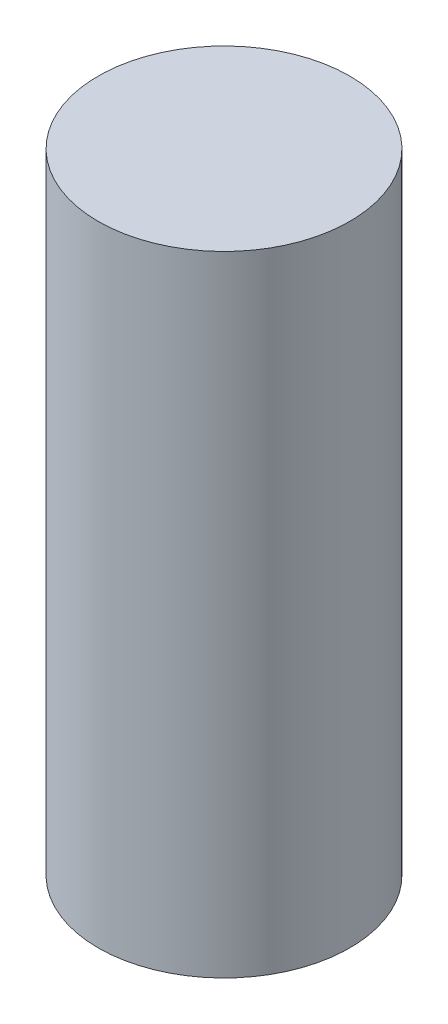
ISO-10303-21;
HEADER;
FILE_DESCRIPTION(('STEP AP214'),'2;1');
FILE_NAME('part.step','',(''),(''),'','','');
FILE_SCHEMA(('AUTOMOTIVE_DESIGN { 1 0 10303 214 1 1 1 1 }'));
ENDSEC;
DATA;
#1=APPLICATION_CONTEXT('core data for automotive mechanical design processes');
#2=APPLICATION_PROTOCOL_DEFINITION('international standard','automotive_design',2000,#1);
#3=PRODUCT_CONTEXT('',#1,'mechanical');
#4=PRODUCT('Part','Part','',(#3));
#5=PRODUCT_RELATED_PRODUCT_CATEGORY('part','',(#4));
#6=PRODUCT_DEFINITION_FORMATION('','',#4);
#7=PRODUCT_DEFINITION_CONTEXT('part definition',#1,'design');
#8=PRODUCT_DEFINITION('design','',#6,#7);
#9=PRODUCT_DEFINITION_SHAPE('','',#8);
#10=(LENGTH_UNIT() NAMED_UNIT(*) SI_UNIT(.MILLI.,.METRE.));
#11=(NAMED_UNIT(*) PLANE_ANGLE_UNIT() SI_UNIT($,.RADIAN.));
#12=(NAMED_UNIT(*) SI_UNIT($,.STERADIAN.) SOLID_ANGLE_UNIT());
#13=UNCERTAINTY_MEASURE_WITH_UNIT(LENGTH_MEASURE(1.E-05),#10,'distance_accuracy_value','');
#14=(GEOMETRIC_REPRESENTATION_CONTEXT(3) GLOBAL_UNCERTAINTY_ASSIGNED_CONTEXT((#13)) GLOBAL_UNIT_ASSIGNED_CONTEXT((#10,
#11,#12)) REPRESENTATION_CONTEXT('',''));
#15=CARTESIAN_POINT('',(0.,0.,0.));
#16=DIRECTION('',(0.,0.,1.));
#17=DIRECTION('',(1.,0.,0.));
#18=AXIS2_PLACEMENT_3D('',#15,#16,#17);
#19=CARTESIAN_POINT('',(0.,100.,0.));
#20=DIRECTION('',(0.,-1.,0.));
#21=DIRECTION('',(0.,0.,-1.));
#22=AXIS2_PLACEMENT_3D('',#19,#20,#21);
#23=CYLINDRICAL_SURFACE('',#22,20.);
#24=CARTESIAN_POINT('',(0.,100.,0.));
#25=DIRECTION('',(0.,1.,0.));
#26=DIRECTION('',(0.,0.,1.));
#27=AXIS2_PLACEMENT_3D('',#24,#25,#26);
#28=CIRCLE('',#27,20.);
#29=CARTESIAN_POINT('',(0.,100.,20.));
#30=VERTEX_POINT('',#29);
#31=EDGE_CURVE('E10',#30,#30,#28,.T.);
#32=ORIENTED_EDGE('',*,*,#31,.F.);
#33=EDGE_LOOP('',(#32));
#34=FACE_BOUND('',#33,.T.);
#35=CARTESIAN_POINT('',(0.,0.,0.));
#36=DIRECTION('',(0.,1.,0.));
#37=DIRECTION('',(0.,0.,1.));
#38=AXIS2_PLACEMENT_3D('',#35,#36,#37);
#39=CIRCLE('',#38,20.);
#40=CARTESIAN_POINT('',(0.,0.,20.));
#41=VERTEX_POINT('',#40);
#42=EDGE_CURVE('E36',#41,#41,#39,.T.);
#43=ORIENTED_EDGE('',*,*,#42,.T.);
#44=EDGE_LOOP('',(#43));
#45=FACE_BOUND('',#44,.T.);
#46=ADVANCED_FACE('F33',(#34,#45),#23,.T.);
#47=CARTESIAN_POINT('',(0.,100.,0.));
#48=DIRECTION('',(0.,1.,0.));
#49=DIRECTION('',(0.,0.,1.));
#50=AXIS2_PLACEMENT_3D('',#47,#48,#49);
#51=PLANE('',#50);
#52=ORIENTED_EDGE('',*,*,#31,.T.);
#53=EDGE_LOOP('',(#52));
#54=FACE_BOUND('',#53,.T.);
#55=ADVANCED_FACE('F48',(#54),#51,.T.);
#56=CARTESIAN_POINT('',(0.,0.,0.));
#57=DIRECTION('',(0.,1.,0.));
#58=DIRECTION('',(0.,0.,1.));
#59=AXIS2_PLACEMENT_3D('',#56,#57,#58);
#60=PLANE('',#59);
#61=ORIENTED_EDGE('',*,*,#42,.F.);
#62=EDGE_LOOP('',(#61));
#63=FACE_BOUND('',#62,.T.);
#64=ADVANCED_FACE('F46',(#63),#60,.F.);
#65=CLOSED_SHELL('',(#46,#55,#64));
#66=MANIFOLD_SOLID_BREP('B2',#65);
#67=ADVANCED_BREP_SHAPE_REPRESENTATION('',(#18,#66),#14);
#68=SHAPE_DEFINITION_REPRESENTATION(#9,#67);
ENDSEC;
END-ISO-10303-21;
